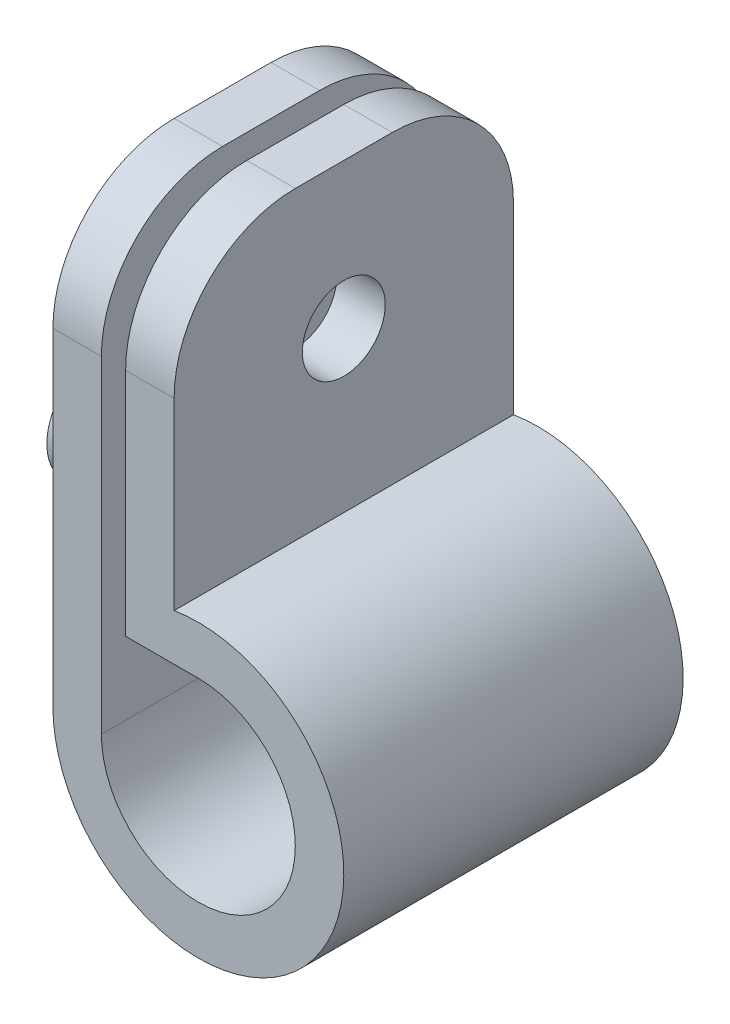
ISO-10303-21;
HEADER;
FILE_DESCRIPTION(('STEP AP214'),'2;1');
FILE_NAME('part.step','',(''),(''),'','','');
FILE_SCHEMA(('AUTOMOTIVE_DESIGN { 1 0 10303 214 1 1 1 1 }'));
ENDSEC;
DATA;
#1=APPLICATION_CONTEXT('core data for automotive mechanical design processes');
#2=APPLICATION_PROTOCOL_DEFINITION('international standard','automotive_design',2000,#1);
#3=PRODUCT_CONTEXT('',#1,'mechanical');
#4=PRODUCT('Part','Part','',(#3));
#5=PRODUCT_RELATED_PRODUCT_CATEGORY('part','',(#4));
#6=PRODUCT_DEFINITION_FORMATION('','',#4);
#7=PRODUCT_DEFINITION_CONTEXT('part definition',#1,'design');
#8=PRODUCT_DEFINITION('design','',#6,#7);
#9=PRODUCT_DEFINITION_SHAPE('','',#8);
#10=(LENGTH_UNIT() NAMED_UNIT(*) SI_UNIT(.MILLI.,.METRE.));
#11=(NAMED_UNIT(*) PLANE_ANGLE_UNIT() SI_UNIT($,.RADIAN.));
#12=(NAMED_UNIT(*) SI_UNIT($,.STERADIAN.) SOLID_ANGLE_UNIT());
#13=UNCERTAINTY_MEASURE_WITH_UNIT(LENGTH_MEASURE(1.E-05),#10,'distance_accuracy_value','');
#14=(GEOMETRIC_REPRESENTATION_CONTEXT(3) GLOBAL_UNCERTAINTY_ASSIGNED_CONTEXT((#13)) GLOBAL_UNIT_ASSIGNED_CONTEXT((#10,
#11,#12)) REPRESENTATION_CONTEXT('',''));
#15=CARTESIAN_POINT('',(0.,0.,0.));
#16=DIRECTION('',(0.,0.,1.));
#17=DIRECTION('',(1.,0.,0.));
#18=AXIS2_PLACEMENT_3D('',#15,#16,#17);
#19=CARTESIAN_POINT('',(474.120322480897,-65.0919042603802,-22.5928633945647));
#20=DIRECTION('',(-1.,0.,0.));
#21=DIRECTION('',(0.,0.,-1.));
#22=AXIS2_PLACEMENT_3D('',#19,#20,#21);
#23=PLANE('',#22);
#24=CARTESIAN_POINT('',(474.12032248089,-60.5919042603772,-29.5928633945558));
#25=DIRECTION('',(-1.,0.,0.));
#26=DIRECTION('',(0.,1.,0.));
#27=AXIS2_PLACEMENT_3D('',#24,#25,#26);
#28=CIRCLE('',#27,2.25);
#29=CARTESIAN_POINT('',(474.12032248089,-58.3419042603772,-29.5928633945558));
#30=VERTEX_POINT('',#29);
#31=EDGE_CURVE('E257',#30,#30,#28,.T.);
#32=ORIENTED_EDGE('',*,*,#31,.F.);
#33=EDGE_LOOP('',(#32));
#34=FACE_BOUND('',#33,.T.);
#35=DIRECTION('',(0.,1.,0.));
#36=VECTOR('',#35,1.);
#37=CARTESIAN_POINT('',(474.120322480897,-65.0919042603802,-22.5928633945647));
#38=LINE('',#37,#36);
#39=CARTESIAN_POINT('',(474.120322480897,-65.0919042603802,-22.5928633945647));
#40=VERTEX_POINT('',#39);
#41=CARTESIAN_POINT('',(474.120322480897,-51.5919042603797,-22.5928633945647));
#42=VERTEX_POINT('',#41);
#43=EDGE_CURVE('E227',#40,#42,#38,.T.);
#44=ORIENTED_EDGE('',*,*,#43,.T.);
#45=CARTESIAN_POINT('',(474.120322480897,-51.5919042603797,-27.5928633945647));
#46=DIRECTION('',(-1.,0.,0.));
#47=DIRECTION('',(0.,0.,1.));
#48=AXIS2_PLACEMENT_3D('',#45,#46,#47);
#49=CIRCLE('',#48,5.);
#50=CARTESIAN_POINT('',(474.120322480897,-46.5919042603797,-27.5928633945647));
#51=VERTEX_POINT('',#50);
#52=EDGE_CURVE('E267',#42,#51,#49,.T.);
#53=ORIENTED_EDGE('',*,*,#52,.T.);
#54=DIRECTION('',(0.,0.,-1.));
#55=VECTOR('',#54,1.);
#56=CARTESIAN_POINT('',(474.120322480897,-46.5919042603797,-22.5928633945646));
#57=LINE('',#56,#55);
#58=CARTESIAN_POINT('',(474.120322480897,-46.5919042603797,-31.5928633945646));
#59=VERTEX_POINT('',#58);
#60=EDGE_CURVE('E236',#51,#59,#57,.T.);
#61=ORIENTED_EDGE('',*,*,#60,.T.);
#62=CARTESIAN_POINT('',(474.120322480897,-51.5919042603797,-31.5928633945646));
#63=DIRECTION('',(-1.,0.,0.));
#64=DIRECTION('',(0.,0.,1.));
#65=AXIS2_PLACEMENT_3D('',#62,#63,#64);
#66=CIRCLE('',#65,5.);
#67=CARTESIAN_POINT('',(474.120322480897,-51.5919042603797,-36.5928633945646));
#68=VERTEX_POINT('',#67);
#69=EDGE_CURVE('E265',#59,#68,#66,.T.);
#70=ORIENTED_EDGE('',*,*,#69,.T.);
#71=DIRECTION('',(0.,1.,0.));
#72=VECTOR('',#71,1.);
#73=CARTESIAN_POINT('',(474.120322480897,-65.0919042603802,-36.5928633945646));
#74=LINE('',#73,#72);
#75=CARTESIAN_POINT('',(474.120322480897,-65.0919042603802,-36.5928633945646));
#76=VERTEX_POINT('',#75);
#77=EDGE_CURVE('E178',#76,#68,#74,.T.);
#78=ORIENTED_EDGE('',*,*,#77,.F.);
#79=DIRECTION('',(0.,0.,-1.));
#80=VECTOR('',#79,1.);
#81=CARTESIAN_POINT('',(474.120322480897,-65.0919042603802,-22.5928633945647));
#82=LINE('',#81,#80);
#83=EDGE_CURVE('E240',#40,#76,#82,.T.);
#84=ORIENTED_EDGE('',*,*,#83,.F.);
#85=EDGE_LOOP('',(#44,#53,#61,#70,#78,#84));
#86=FACE_BOUND('',#85,.T.);
#87=CARTESIAN_POINT('',(474.120322480897,-52.5919042603772,-29.5928633945558));
#88=DIRECTION('',(-1.,0.,0.));
#89=DIRECTION('',(0.,-1.,0.));
#90=AXIS2_PLACEMENT_3D('',#87,#88,#89);
#91=CIRCLE('',#90,1.71021440932199);
#92=CARTESIAN_POINT('',(474.120322480897,-54.3021186696992,-29.5928633945558));
#93=VERTEX_POINT('',#92);
#94=EDGE_CURVE('E185',#93,#93,#91,.T.);
#95=ORIENTED_EDGE('',*,*,#94,.F.);
#96=EDGE_LOOP('',(#95));
#97=FACE_BOUND('',#96,.T.);
#98=ADVANCED_FACE('F58',(#34,#86,#97),#23,.T.);
#99=CARTESIAN_POINT('',(480.120322480897,-65.0919042603802,-22.5928633945647));
#100=DIRECTION('',(0.,0.,-1.));
#101=DIRECTION('',(0.,1.,0.));
#102=AXIS2_PLACEMENT_3D('',#99,#100,#101);
#103=CYLINDRICAL_SURFACE('',#102,4.);
#104=CARTESIAN_POINT('',(480.120322480897,-65.0919042603802,-36.5928633945646));
#105=DIRECTION('',(0.,0.,1.));
#106=DIRECTION('',(0.,-1.,0.));
#107=AXIS2_PLACEMENT_3D('',#104,#105,#106);
#108=CIRCLE('',#107,4.);
#109=CARTESIAN_POINT('',(476.120322480897,-65.0919042603802,-36.5928633945646));
#110=VERTEX_POINT('',#109);
#111=CARTESIAN_POINT('',(480.120322480897,-61.0919042603802,-36.5928633945646));
#112=VERTEX_POINT('',#111);
#113=EDGE_CURVE('E173',#110,#112,#108,.T.);
#114=ORIENTED_EDGE('',*,*,#113,.F.);
#115=DIRECTION('',(0.,0.,-1.));
#116=VECTOR('',#115,1.);
#117=CARTESIAN_POINT('',(476.120322480897,-65.0919042603802,-22.5928633945647));
#118=LINE('',#117,#116);
#119=CARTESIAN_POINT('',(476.120322480897,-65.0919042603802,-22.5928633945647));
#120=VERTEX_POINT('',#119);
#121=EDGE_CURVE('E153',#120,#110,#118,.T.);
#122=ORIENTED_EDGE('',*,*,#121,.F.);
#123=CARTESIAN_POINT('',(480.120322480897,-65.0919042603802,-22.5928633945647));
#124=DIRECTION('',(0.,0.,1.));
#125=DIRECTION('',(0.,-1.,0.));
#126=AXIS2_PLACEMENT_3D('',#123,#124,#125);
#127=CIRCLE('',#126,4.);
#128=CARTESIAN_POINT('',(480.120322480897,-61.0919042603802,-22.5928633945646));
#129=VERTEX_POINT('',#128);
#130=EDGE_CURVE('E177',#120,#129,#127,.T.);
#131=ORIENTED_EDGE('',*,*,#130,.T.);
#132=DIRECTION('',(0.,0.,-1.));
#133=VECTOR('',#132,1.);
#134=CARTESIAN_POINT('',(480.120322480897,-61.0919042603802,-22.5928633945646));
#135=LINE('',#134,#133);
#136=EDGE_CURVE('E181',#129,#112,#135,.T.);
#137=ORIENTED_EDGE('',*,*,#136,.T.);
#138=EDGE_LOOP('',(#114,#122,#131,#137));
#139=FACE_BOUND('',#138,.T.);
#140=ADVANCED_FACE('F180',(#139),#103,.F.);
#141=CARTESIAN_POINT('',(477.120322480897,-61.0919042603802,-22.5928633945646));
#142=DIRECTION('',(0.,1.,0.));
#143=DIRECTION('',(0.,0.,1.));
#144=AXIS2_PLACEMENT_3D('',#141,#142,#143);
#145=PLANE('',#144);
#146=DIRECTION('',(1.,0.,0.));
#147=VECTOR('',#146,1.);
#148=CARTESIAN_POINT('',(477.120322480897,-61.0919042603802,-36.5928633945646));
#149=LINE('',#148,#147);
#150=CARTESIAN_POINT('',(477.120322480897,-61.0919042603802,-36.5928633945646));
#151=VERTEX_POINT('',#150);
#152=EDGE_CURVE('E184',#151,#112,#149,.T.);
#153=ORIENTED_EDGE('',*,*,#152,.T.);
#154=ORIENTED_EDGE('',*,*,#136,.F.);
#155=DIRECTION('',(1.,0.,0.));
#156=VECTOR('',#155,1.);
#157=CARTESIAN_POINT('',(477.120322480897,-61.0919042603802,-22.5928633945646));
#158=LINE('',#157,#156);
#159=CARTESIAN_POINT('',(477.120322480897,-61.0919042603802,-22.5928633945646));
#160=VERTEX_POINT('',#159);
#161=EDGE_CURVE('E211',#160,#129,#158,.T.);
#162=ORIENTED_EDGE('',*,*,#161,.F.);
#163=DIRECTION('',(0.,0.,-1.));
#164=VECTOR('',#163,1.);
#165=CARTESIAN_POINT('',(477.120322480897,-61.0919042603802,-22.5928633945646));
#166=LINE('',#165,#164);
#167=EDGE_CURVE('E253',#160,#151,#166,.T.);
#168=ORIENTED_EDGE('',*,*,#167,.T.);
#169=EDGE_LOOP('',(#153,#154,#162,#168));
#170=FACE_BOUND('',#169,.T.);
#171=ADVANCED_FACE('F308',(#170),#145,.F.);
#172=CARTESIAN_POINT('',(477.120322480897,-61.0919042603802,-22.5928633945646));
#173=DIRECTION('',(-1.,0.,0.));
#174=DIRECTION('',(0.,-1.,0.));
#175=AXIS2_PLACEMENT_3D('',#172,#173,#174);
#176=PLANE('',#175);
#177=CARTESIAN_POINT('',(477.120322480897,-52.5919042603772,-29.5928633945558));
#178=DIRECTION('',(-1.,0.,0.));
#179=DIRECTION('',(0.,-1.,0.));
#180=AXIS2_PLACEMENT_3D('',#177,#178,#179);
#181=CIRCLE('',#180,1.71021440932199);
#182=CARTESIAN_POINT('',(477.120322480897,-54.3021186696992,-29.5928633945558));
#183=VERTEX_POINT('',#182);
#184=EDGE_CURVE('E193',#183,#183,#181,.T.);
#185=ORIENTED_EDGE('',*,*,#184,.F.);
#186=EDGE_LOOP('',(#185));
#187=FACE_BOUND('',#186,.T.);
#188=DIRECTION('',(0.,0.,-1.));
#189=VECTOR('',#188,1.);
#190=CARTESIAN_POINT('',(477.120322480897,-46.5919042603797,-22.5928633945646));
#191=LINE('',#190,#189);
#192=CARTESIAN_POINT('',(477.120322480897,-46.5919042603797,-27.5928633945647));
#193=VERTEX_POINT('',#192);
#194=CARTESIAN_POINT('',(477.120322480897,-46.5919042603797,-31.5928633945646));
#195=VERTEX_POINT('',#194);
#196=EDGE_CURVE('E249',#193,#195,#191,.T.);
#197=ORIENTED_EDGE('',*,*,#196,.T.);
#198=CARTESIAN_POINT('',(477.120322480897,-51.5919042603797,-31.5928633945646));
#199=DIRECTION('',(-1.,0.,0.));
#200=DIRECTION('',(0.,-1.,0.));
#201=AXIS2_PLACEMENT_3D('',#198,#199,#200);
#202=CIRCLE('',#201,5.);
#203=CARTESIAN_POINT('',(477.120322480897,-51.5919042603797,-36.5928633945646));
#204=VERTEX_POINT('',#203);
#205=EDGE_CURVE('E287',#195,#204,#202,.T.);
#206=ORIENTED_EDGE('',*,*,#205,.T.);
#207=DIRECTION('',(0.,1.,0.));
#208=VECTOR('',#207,1.);
#209=CARTESIAN_POINT('',(477.120322480897,-61.0919042603802,-36.5928633945646));
#210=LINE('',#209,#208);
#211=EDGE_CURVE('E190',#151,#204,#210,.T.);
#212=ORIENTED_EDGE('',*,*,#211,.F.);
#213=ORIENTED_EDGE('',*,*,#167,.F.);
#214=DIRECTION('',(0.,1.,0.));
#215=VECTOR('',#214,1.);
#216=CARTESIAN_POINT('',(477.120322480897,-61.0919042603802,-22.5928633945646));
#217=LINE('',#216,#215);
#218=CARTESIAN_POINT('',(477.120322480897,-51.5919042603797,-22.5928633945647));
#219=VERTEX_POINT('',#218);
#220=EDGE_CURVE('E215',#160,#219,#217,.T.);
#221=ORIENTED_EDGE('',*,*,#220,.T.);
#222=CARTESIAN_POINT('',(477.120322480897,-51.5919042603797,-27.5928633945647));
#223=DIRECTION('',(-1.,0.,0.));
#224=DIRECTION('',(0.,-1.,0.));
#225=AXIS2_PLACEMENT_3D('',#222,#223,#224);
#226=CIRCLE('',#225,5.);
#227=EDGE_CURVE('E285',#219,#193,#226,.T.);
#228=ORIENTED_EDGE('',*,*,#227,.T.);
#229=EDGE_LOOP('',(#197,#206,#212,#213,#221,#228));
#230=FACE_BOUND('',#229,.T.);
#231=ADVANCED_FACE('F299',(#187,#230),#176,.T.);
#232=CARTESIAN_POINT('',(479.120322480897,-46.5919042603797,-22.5928633945646));
#233=DIRECTION('',(0.,-1.,0.));
#234=DIRECTION('',(1.,0.,0.));
#235=AXIS2_PLACEMENT_3D('',#232,#233,#234);
#236=PLANE('',#235);
#237=DIRECTION('',(0.,0.,-1.));
#238=VECTOR('',#237,1.);
#239=CARTESIAN_POINT('',(479.120322480897,-46.5919042603797,-22.5928633945646));
#240=LINE('',#239,#238);
#241=CARTESIAN_POINT('',(479.120322480897,-46.5919042603797,-27.5928633945647));
#242=VERTEX_POINT('',#241);
#243=CARTESIAN_POINT('',(479.120322480897,-46.5919042603797,-31.5928633945646));
#244=VERTEX_POINT('',#243);
#245=EDGE_CURVE('E246',#242,#244,#240,.T.);
#246=ORIENTED_EDGE('',*,*,#245,.T.);
#247=DIRECTION('',(-1.,0.,0.));
#248=VECTOR('',#247,1.);
#249=CARTESIAN_POINT('',(479.120322480897,-46.5919042603797,-31.5928633945646));
#250=LINE('',#249,#248);
#251=EDGE_CURVE('E282',#244,#195,#250,.T.);
#252=ORIENTED_EDGE('',*,*,#251,.T.);
#253=ORIENTED_EDGE('',*,*,#196,.F.);
#254=DIRECTION('',(-1.,0.,0.));
#255=VECTOR('',#254,1.);
#256=CARTESIAN_POINT('',(479.120322480897,-46.5919042603797,-27.5928633945647));
#257=LINE('',#256,#255);
#258=EDGE_CURVE('E78',#193,#242,#257,.F.);
#259=ORIENTED_EDGE('',*,*,#258,.T.);
#260=EDGE_LOOP('',(#246,#252,#253,#259));
#261=FACE_BOUND('',#260,.T.);
#262=ADVANCED_FACE('F300',(#261),#236,.F.);
#263=CARTESIAN_POINT('',(479.120322480897,-59.1758244772802,-22.5928633945646));
#264=DIRECTION('',(-1.,0.,0.));
#265=DIRECTION('',(0.,-1.,0.));
#266=AXIS2_PLACEMENT_3D('',#263,#264,#265);
#267=PLANE('',#266);
#268=CARTESIAN_POINT('',(479.120322480897,-52.5919042603772,-29.5928633945558));
#269=DIRECTION('',(-1.,0.,0.));
#270=DIRECTION('',(0.,-1.,0.));
#271=AXIS2_PLACEMENT_3D('',#268,#269,#270);
#272=CIRCLE('',#271,1.71021440932199);
#273=CARTESIAN_POINT('',(479.120322480897,-54.3021186696992,-29.5928633945558));
#274=VERTEX_POINT('',#273);
#275=EDGE_CURVE('E384',#274,#274,#272,.T.);
#276=ORIENTED_EDGE('',*,*,#275,.T.);
#277=EDGE_LOOP('',(#276));
#278=FACE_BOUND('',#277,.T.);
#279=DIRECTION('',(0.,1.,0.));
#280=VECTOR('',#279,1.);
#281=CARTESIAN_POINT('',(479.120322480897,-59.1758244772802,-36.5928633945646));
#282=LINE('',#281,#280);
#283=CARTESIAN_POINT('',(479.120322480897,-59.1758244772802,-36.5928633945646));
#284=VERTEX_POINT('',#283);
#285=CARTESIAN_POINT('',(479.120322480897,-51.5919042603797,-36.5928633945647));
#286=VERTEX_POINT('',#285);
#287=EDGE_CURVE('E200',#284,#286,#282,.T.);
#288=ORIENTED_EDGE('',*,*,#287,.T.);
#289=CARTESIAN_POINT('',(479.120322480897,-51.5919042603797,-31.5928633945646));
#290=DIRECTION('',(-1.,0.,0.));
#291=DIRECTION('',(0.,-1.,0.));
#292=AXIS2_PLACEMENT_3D('',#289,#290,#291);
#293=CIRCLE('',#292,5.);
#294=EDGE_CURVE('E11',#286,#244,#293,.F.);
#295=ORIENTED_EDGE('',*,*,#294,.T.);
#296=ORIENTED_EDGE('',*,*,#245,.F.);
#297=CARTESIAN_POINT('',(479.120322480897,-51.5919042603797,-27.5928633945647));
#298=DIRECTION('',(-1.,0.,0.));
#299=DIRECTION('',(0.,-1.,0.));
#300=AXIS2_PLACEMENT_3D('',#297,#298,#299);
#301=CIRCLE('',#300,5.);
#302=CARTESIAN_POINT('',(479.120322480897,-51.5919042603797,-22.5928633945647));
#303=VERTEX_POINT('',#302);
#304=EDGE_CURVE('E66',#242,#303,#301,.F.);
#305=ORIENTED_EDGE('',*,*,#304,.T.);
#306=DIRECTION('',(0.,1.,0.));
#307=VECTOR('',#306,1.);
#308=CARTESIAN_POINT('',(479.120322480897,-59.1758244772802,-22.5928633945646));
#309=LINE('',#308,#307);
#310=CARTESIAN_POINT('',(479.120322480897,-59.1758244772802,-22.5928633945646));
#311=VERTEX_POINT('',#310);
#312=EDGE_CURVE('E219',#311,#303,#309,.T.);
#313=ORIENTED_EDGE('',*,*,#312,.F.);
#314=DIRECTION('',(0.,0.,-1.));
#315=VECTOR('',#314,1.);
#316=CARTESIAN_POINT('',(479.120322480897,-59.1758244772802,-22.5928633945646));
#317=LINE('',#316,#315);
#318=EDGE_CURVE('E243',#311,#284,#317,.T.);
#319=ORIENTED_EDGE('',*,*,#318,.T.);
#320=EDGE_LOOP('',(#288,#295,#296,#305,#313,#319));
#321=FACE_BOUND('',#320,.T.);
#322=ADVANCED_FACE('F290',(#278,#321),#267,.F.);
#323=CARTESIAN_POINT('',(480.120322480897,-65.0919042603802,-22.5928633945647));
#324=DIRECTION('',(0.,0.,-1.));
#325=DIRECTION('',(0.,1.,0.));
#326=AXIS2_PLACEMENT_3D('',#323,#324,#325);
#327=CYLINDRICAL_SURFACE('',#326,6.);
#328=CARTESIAN_POINT('',(480.120322480897,-65.0919042603802,-36.5928633945646));
#329=DIRECTION('',(0.,0.,1.));
#330=DIRECTION('',(0.,-1.,0.));
#331=AXIS2_PLACEMENT_3D('',#328,#329,#330);
#332=CIRCLE('',#331,6.);
#333=EDGE_CURVE('E203',#76,#284,#332,.T.);
#334=ORIENTED_EDGE('',*,*,#333,.T.);
#335=ORIENTED_EDGE('',*,*,#318,.F.);
#336=CARTESIAN_POINT('',(480.120322480897,-65.0919042603802,-22.5928633945647));
#337=DIRECTION('',(0.,0.,1.));
#338=DIRECTION('',(0.,-1.,0.));
#339=AXIS2_PLACEMENT_3D('',#336,#337,#338);
#340=CIRCLE('',#339,6.);
#341=EDGE_CURVE('E223',#40,#311,#340,.T.);
#342=ORIENTED_EDGE('',*,*,#341,.F.);
#343=ORIENTED_EDGE('',*,*,#83,.T.);
#344=EDGE_LOOP('',(#334,#335,#342,#343));
#345=FACE_BOUND('',#344,.T.);
#346=ADVANCED_FACE('F326',(#345),#327,.T.);
#347=CARTESIAN_POINT('',(476.120322480897,-46.5919042603797,-22.5928633945646));
#348=DIRECTION('',(0.,-1.,0.));
#349=DIRECTION('',(0.,0.,-1.));
#350=AXIS2_PLACEMENT_3D('',#347,#348,#349);
#351=PLANE('',#350);
#352=ORIENTED_EDGE('',*,*,#60,.F.);
#353=DIRECTION('',(-1.,0.,0.));
#354=VECTOR('',#353,1.);
#355=CARTESIAN_POINT('',(476.120322480897,-46.5919042603797,-27.5928633945647));
#356=LINE('',#355,#354);
#357=CARTESIAN_POINT('',(476.120322480897,-46.5919042603797,-27.5928633945647));
#358=VERTEX_POINT('',#357);
#359=EDGE_CURVE('E272',#51,#358,#356,.F.);
#360=ORIENTED_EDGE('',*,*,#359,.T.);
#361=DIRECTION('',(0.,0.,-1.));
#362=VECTOR('',#361,1.);
#363=CARTESIAN_POINT('',(476.120322480897,-46.5919042603797,-22.5928633945646));
#364=LINE('',#363,#362);
#365=CARTESIAN_POINT('',(476.120322480897,-46.5919042603797,-31.5928633945646));
#366=VERTEX_POINT('',#365);
#367=EDGE_CURVE('E166',#358,#366,#364,.T.);
#368=ORIENTED_EDGE('',*,*,#367,.T.);
#369=DIRECTION('',(-1.,0.,0.));
#370=VECTOR('',#369,1.);
#371=CARTESIAN_POINT('',(476.120322480897,-46.5919042603797,-31.5928633945646));
#372=LINE('',#371,#370);
#373=EDGE_CURVE('E269',#366,#59,#372,.T.);
#374=ORIENTED_EDGE('',*,*,#373,.T.);
#375=EDGE_LOOP('',(#352,#360,#368,#374));
#376=FACE_BOUND('',#375,.T.);
#377=ADVANCED_FACE('F319',(#376),#351,.F.);
#378=CARTESIAN_POINT('',(476.120322480897,-65.0919042603802,-22.5928633945647));
#379=DIRECTION('',(-1.,0.,0.));
#380=DIRECTION('',(0.,0.,-1.));
#381=AXIS2_PLACEMENT_3D('',#378,#379,#380);
#382=PLANE('',#381);
#383=CARTESIAN_POINT('',(476.120322480897,-52.5919042603772,-29.5928633945558));
#384=DIRECTION('',(-1.,0.,0.));
#385=DIRECTION('',(0.,-1.,0.));
#386=AXIS2_PLACEMENT_3D('',#383,#384,#385);
#387=CIRCLE('',#386,1.71021440932199);
#388=CARTESIAN_POINT('',(476.120322480897,-54.3021186696992,-29.5928633945558));
#389=VERTEX_POINT('',#388);
#390=EDGE_CURVE('E379',#389,#389,#387,.T.);
#391=ORIENTED_EDGE('',*,*,#390,.T.);
#392=EDGE_LOOP('',(#391));
#393=FACE_BOUND('',#392,.T.);
#394=ORIENTED_EDGE('',*,*,#367,.F.);
#395=CARTESIAN_POINT('',(476.120322480897,-51.5919042603797,-27.5928633945647));
#396=DIRECTION('',(-1.,0.,0.));
#397=DIRECTION('',(0.,0.,1.));
#398=AXIS2_PLACEMENT_3D('',#395,#396,#397);
#399=CIRCLE('',#398,5.);
#400=CARTESIAN_POINT('',(476.120322480897,-51.5919042603797,-22.5928633945647));
#401=VERTEX_POINT('',#400);
#402=EDGE_CURVE('E276',#358,#401,#399,.F.);
#403=ORIENTED_EDGE('',*,*,#402,.T.);
#404=DIRECTION('',(0.,1.,0.));
#405=VECTOR('',#404,1.);
#406=CARTESIAN_POINT('',(476.120322480897,-65.0919042603802,-22.5928633945647));
#407=LINE('',#406,#405);
#408=EDGE_CURVE('E160',#120,#401,#407,.T.);
#409=ORIENTED_EDGE('',*,*,#408,.F.);
#410=ORIENTED_EDGE('',*,*,#121,.T.);
#411=DIRECTION('',(0.,1.,0.));
#412=VECTOR('',#411,1.);
#413=CARTESIAN_POINT('',(476.120322480897,-65.0919042603802,-36.5928633945646));
#414=LINE('',#413,#412);
#415=CARTESIAN_POINT('',(476.120322480897,-51.5919042603797,-36.5928633945646));
#416=VERTEX_POINT('',#415);
#417=EDGE_CURVE('E157',#110,#416,#414,.T.);
#418=ORIENTED_EDGE('',*,*,#417,.T.);
#419=CARTESIAN_POINT('',(476.120322480897,-51.5919042603797,-31.5928633945646));
#420=DIRECTION('',(-1.,0.,0.));
#421=DIRECTION('',(0.,0.,1.));
#422=AXIS2_PLACEMENT_3D('',#419,#420,#421);
#423=CIRCLE('',#422,5.);
#424=EDGE_CURVE('E274',#416,#366,#423,.F.);
#425=ORIENTED_EDGE('',*,*,#424,.T.);
#426=EDGE_LOOP('',(#394,#403,#409,#410,#418,#425));
#427=FACE_BOUND('',#426,.T.);
#428=ADVANCED_FACE('F156',(#393,#427),#382,.F.);
#429=CARTESIAN_POINT('',(480.120322480897,-65.0919042603802,-22.5928633945647));
#430=DIRECTION('',(0.,0.,1.));
#431=DIRECTION('',(0.,-1.,0.));
#432=AXIS2_PLACEMENT_3D('',#429,#430,#431);
#433=PLANE('',#432);
#434=ORIENTED_EDGE('',*,*,#408,.T.);
#435=DIRECTION('',(-1.,0.,0.));
#436=VECTOR('',#435,1.);
#437=CARTESIAN_POINT('',(474.120322480897,-51.5919042603797,-22.5928633945647));
#438=LINE('',#437,#436);
#439=EDGE_CURVE('E262',#401,#42,#438,.T.);
#440=ORIENTED_EDGE('',*,*,#439,.T.);
#441=ORIENTED_EDGE('',*,*,#43,.F.);
#442=ORIENTED_EDGE('',*,*,#341,.T.);
#443=ORIENTED_EDGE('',*,*,#312,.T.);
#444=DIRECTION('',(-1.,0.,0.));
#445=VECTOR('',#444,1.);
#446=CARTESIAN_POINT('',(477.120322480897,-51.5919042603797,-22.5928633945647));
#447=LINE('',#446,#445);
#448=EDGE_CURVE('E259',#303,#219,#447,.T.);
#449=ORIENTED_EDGE('',*,*,#448,.T.);
#450=ORIENTED_EDGE('',*,*,#220,.F.);
#451=ORIENTED_EDGE('',*,*,#161,.T.);
#452=ORIENTED_EDGE('',*,*,#130,.F.);
#453=EDGE_LOOP('',(#434,#440,#441,#442,#443,#449,#450,#451,#452));
#454=FACE_BOUND('',#453,.T.);
#455=ADVANCED_FACE('F294',(#454),#433,.T.);
#456=CARTESIAN_POINT('',(480.120322480897,-65.0919042603802,-36.5928633945646));
#457=DIRECTION('',(0.,0.,1.));
#458=DIRECTION('',(0.,-1.,0.));
#459=AXIS2_PLACEMENT_3D('',#456,#457,#458);
#460=PLANE('',#459);
#461=ORIENTED_EDGE('',*,*,#77,.T.);
#462=DIRECTION('',(-1.,0.,0.));
#463=VECTOR('',#462,1.);
#464=CARTESIAN_POINT('',(480.120322480897,-51.5919042603797,-36.5928633945646));
#465=LINE('',#464,#463);
#466=EDGE_CURVE('E175',#68,#416,#465,.F.);
#467=ORIENTED_EDGE('',*,*,#466,.T.);
#468=ORIENTED_EDGE('',*,*,#417,.F.);
#469=ORIENTED_EDGE('',*,*,#113,.T.);
#470=ORIENTED_EDGE('',*,*,#152,.F.);
#471=ORIENTED_EDGE('',*,*,#211,.T.);
#472=DIRECTION('',(-1.,0.,0.));
#473=VECTOR('',#472,1.);
#474=CARTESIAN_POINT('',(480.120322480897,-51.5919042603797,-36.5928633945646));
#475=LINE('',#474,#473);
#476=EDGE_CURVE('E278',#204,#286,#475,.F.);
#477=ORIENTED_EDGE('',*,*,#476,.T.);
#478=ORIENTED_EDGE('',*,*,#287,.F.);
#479=ORIENTED_EDGE('',*,*,#333,.F.);
#480=EDGE_LOOP('',(#461,#467,#468,#469,#470,#471,#477,#478,#479));
#481=FACE_BOUND('',#480,.T.);
#482=ADVANCED_FACE('F171',(#481),#460,.F.);
#483=CARTESIAN_POINT('',(445.62032248089,-52.5919042603772,-29.5928633945558));
#484=DIRECTION('',(1.,0.,0.));
#485=DIRECTION('',(0.,1.,0.));
#486=AXIS2_PLACEMENT_3D('',#483,#484,#485);
#487=CYLINDRICAL_SURFACE('',#486,1.71021440932199);
#488=ORIENTED_EDGE('',*,*,#94,.T.);
#489=EDGE_LOOP('',(#488));
#490=FACE_BOUND('',#489,.T.);
#491=ORIENTED_EDGE('',*,*,#390,.F.);
#492=EDGE_LOOP('',(#491));
#493=FACE_BOUND('',#492,.T.);
#494=ADVANCED_FACE('F357',(#490,#493),#487,.F.);
#495=ORIENTED_EDGE('',*,*,#184,.T.);
#496=EDGE_LOOP('',(#495));
#497=FACE_BOUND('',#496,.T.);
#498=ORIENTED_EDGE('',*,*,#275,.F.);
#499=EDGE_LOOP('',(#498));
#500=FACE_BOUND('',#499,.T.);
#501=ADVANCED_FACE('F358',(#497,#500),#487,.F.);
#502=CARTESIAN_POINT('',(474.12032248089,-60.5919042603772,-29.5928633945558));
#503=DIRECTION('',(-1.,0.,0.));
#504=DIRECTION('',(0.,-1.,0.));
#505=AXIS2_PLACEMENT_3D('',#502,#503,#504);
#506=CYLINDRICAL_SURFACE('',#505,2.25);
#507=ORIENTED_EDGE('',*,*,#31,.T.);
#508=EDGE_LOOP('',(#507));
#509=FACE_BOUND('',#508,.T.);
#510=CARTESIAN_POINT('',(469.12032248089,-60.5919042603772,-29.5928633945558));
#511=DIRECTION('',(-1.,0.,0.));
#512=DIRECTION('',(0.,1.,0.));
#513=AXIS2_PLACEMENT_3D('',#510,#511,#512);
#514=CIRCLE('',#513,2.25);
#515=CARTESIAN_POINT('',(469.12032248089,-58.3419042603772,-29.5928633945558));
#516=VERTEX_POINT('',#515);
#517=EDGE_CURVE('E376',#516,#516,#514,.T.);
#518=ORIENTED_EDGE('',*,*,#517,.F.);
#519=EDGE_LOOP('',(#518));
#520=FACE_BOUND('',#519,.T.);
#521=ADVANCED_FACE('F361',(#509,#520),#506,.T.);
#522=CARTESIAN_POINT('',(469.12032248089,-60.5919042603772,-29.5928633945558));
#523=DIRECTION('',(-1.,0.,0.));
#524=DIRECTION('',(0.,-1.,0.));
#525=AXIS2_PLACEMENT_3D('',#522,#523,#524);
#526=PLANE('',#525);
#527=ORIENTED_EDGE('',*,*,#517,.T.);
#528=EDGE_LOOP('',(#527));
#529=FACE_BOUND('',#528,.T.);
#530=ADVANCED_FACE('F365',(#529),#526,.T.);
#531=CARTESIAN_POINT('',(480.120322480897,-51.5919042603797,-27.5928633945647));
#532=DIRECTION('',(1.,0.,0.));
#533=DIRECTION('',(0.,0.,-1.));
#534=AXIS2_PLACEMENT_3D('',#531,#532,#533);
#535=CYLINDRICAL_SURFACE('',#534,5.);
#536=ORIENTED_EDGE('',*,*,#402,.F.);
#537=ORIENTED_EDGE('',*,*,#359,.F.);
#538=ORIENTED_EDGE('',*,*,#52,.F.);
#539=ORIENTED_EDGE('',*,*,#439,.F.);
#540=EDGE_LOOP('',(#536,#537,#538,#539));
#541=FACE_BOUND('',#540,.T.);
#542=ADVANCED_FACE('F313',(#541),#535,.T.);
#543=CARTESIAN_POINT('',(476.120322480897,-51.5919042603797,-31.5928633945646));
#544=DIRECTION('',(-1.,0.,0.));
#545=DIRECTION('',(0.,0.,1.));
#546=AXIS2_PLACEMENT_3D('',#543,#544,#545);
#547=CYLINDRICAL_SURFACE('',#546,5.);
#548=ORIENTED_EDGE('',*,*,#424,.F.);
#549=ORIENTED_EDGE('',*,*,#466,.F.);
#550=ORIENTED_EDGE('',*,*,#69,.F.);
#551=ORIENTED_EDGE('',*,*,#373,.F.);
#552=EDGE_LOOP('',(#548,#549,#550,#551));
#553=FACE_BOUND('',#552,.T.);
#554=ADVANCED_FACE('F322',(#553),#547,.T.);
#555=CARTESIAN_POINT('',(479.120322480897,-51.5919042603797,-31.5928633945646));
#556=DIRECTION('',(-1.,0.,0.));
#557=DIRECTION('',(0.,-1.,0.));
#558=AXIS2_PLACEMENT_3D('',#555,#556,#557);
#559=CYLINDRICAL_SURFACE('',#558,5.);
#560=ORIENTED_EDGE('',*,*,#294,.F.);
#561=ORIENTED_EDGE('',*,*,#476,.F.);
#562=ORIENTED_EDGE('',*,*,#205,.F.);
#563=ORIENTED_EDGE('',*,*,#251,.F.);
#564=EDGE_LOOP('',(#560,#561,#562,#563));
#565=FACE_BOUND('',#564,.T.);
#566=ADVANCED_FACE('F303',(#565),#559,.T.);
#567=CARTESIAN_POINT('',(480.120322480897,-51.5919042603797,-27.5928633945647));
#568=DIRECTION('',(1.,0.,0.));
#569=DIRECTION('',(0.,1.,0.));
#570=AXIS2_PLACEMENT_3D('',#567,#568,#569);
#571=CYLINDRICAL_SURFACE('',#570,5.);
#572=ORIENTED_EDGE('',*,*,#304,.F.);
#573=ORIENTED_EDGE('',*,*,#258,.F.);
#574=ORIENTED_EDGE('',*,*,#227,.F.);
#575=ORIENTED_EDGE('',*,*,#448,.F.);
#576=EDGE_LOOP('',(#572,#573,#574,#575));
#577=FACE_BOUND('',#576,.T.);
#578=ADVANCED_FACE('F60',(#577),#571,.T.);
#579=CLOSED_SHELL('',(#98,#140,#171,#231,#262,#322,#346,#377,#428,#455,#482,#494,#501,#521,#530,
#542,#554,#566,#578));
#580=MANIFOLD_SOLID_BREP('B2',#579);
#581=ADVANCED_BREP_SHAPE_REPRESENTATION('',(#18,#580),#14);
#582=SHAPE_DEFINITION_REPRESENTATION(#9,#581);
ENDSEC;
END-ISO-10303-21;
